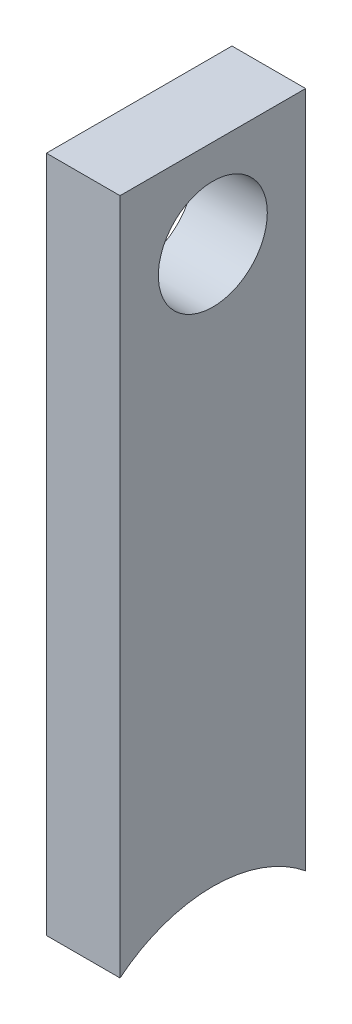
ISO-10303-21;
HEADER;
FILE_DESCRIPTION(('STEP AP214'),'2;1');
FILE_NAME('part.step','',(''),(''),'','','');
FILE_SCHEMA(('AUTOMOTIVE_DESIGN { 1 0 10303 214 1 1 1 1 }'));
ENDSEC;
DATA;
#1=APPLICATION_CONTEXT('core data for automotive mechanical design processes');
#2=APPLICATION_PROTOCOL_DEFINITION('international standard','automotive_design',2000,#1);
#3=PRODUCT_CONTEXT('',#1,'mechanical');
#4=PRODUCT('Part','Part','',(#3));
#5=PRODUCT_RELATED_PRODUCT_CATEGORY('part','',(#4));
#6=PRODUCT_DEFINITION_FORMATION('','',#4);
#7=PRODUCT_DEFINITION_CONTEXT('part definition',#1,'design');
#8=PRODUCT_DEFINITION('design','',#6,#7);
#9=PRODUCT_DEFINITION_SHAPE('','',#8);
#10=(LENGTH_UNIT() NAMED_UNIT(*) SI_UNIT(.MILLI.,.METRE.));
#11=(NAMED_UNIT(*) PLANE_ANGLE_UNIT() SI_UNIT($,.RADIAN.));
#12=(NAMED_UNIT(*) SI_UNIT($,.STERADIAN.) SOLID_ANGLE_UNIT());
#13=UNCERTAINTY_MEASURE_WITH_UNIT(LENGTH_MEASURE(1.E-05),#10,'distance_accuracy_value','');
#14=(GEOMETRIC_REPRESENTATION_CONTEXT(3) GLOBAL_UNCERTAINTY_ASSIGNED_CONTEXT((#13)) GLOBAL_UNIT_ASSIGNED_CONTEXT((#10,
#11,#12)) REPRESENTATION_CONTEXT('',''));
#15=CARTESIAN_POINT('',(0.,0.,0.));
#16=DIRECTION('',(0.,0.,1.));
#17=DIRECTION('',(1.,0.,0.));
#18=AXIS2_PLACEMENT_3D('',#15,#16,#17);
#19=CARTESIAN_POINT('',(25.,-115.,-31.5));
#20=DIRECTION('',(0.,0.,1.));
#21=DIRECTION('',(1.,0.,0.));
#22=AXIS2_PLACEMENT_3D('',#19,#20,#21);
#23=PLANE('',#22);
#24=DIRECTION('',(0.,1.,0.));
#25=VECTOR('',#24,1.);
#26=CARTESIAN_POINT('',(0.,-115.,-31.5));
#27=LINE('',#26,#25);
#28=CARTESIAN_POINT('',(0.,-115.,-31.5));
#29=VERTEX_POINT('',#28);
#30=CARTESIAN_POINT('',(0.,115.,-31.5));
#31=VERTEX_POINT('',#30);
#32=EDGE_CURVE('E96',#29,#31,#27,.T.);
#33=ORIENTED_EDGE('',*,*,#32,.T.);
#34=DIRECTION('',(-1.,0.,0.));
#35=VECTOR('',#34,1.);
#36=CARTESIAN_POINT('',(25.,115.,-31.5));
#37=LINE('',#36,#35);
#38=CARTESIAN_POINT('',(25.,115.,-31.5));
#39=VERTEX_POINT('',#38);
#40=EDGE_CURVE('E11',#39,#31,#37,.T.);
#41=ORIENTED_EDGE('',*,*,#40,.F.);
#42=DIRECTION('',(0.,1.,0.));
#43=VECTOR('',#42,1.);
#44=CARTESIAN_POINT('',(25.,-115.,-31.5));
#45=LINE('',#44,#43);
#46=CARTESIAN_POINT('',(25.,-115.,-31.5));
#47=VERTEX_POINT('',#46);
#48=EDGE_CURVE('E84',#47,#39,#45,.T.);
#49=ORIENTED_EDGE('',*,*,#48,.F.);
#50=DIRECTION('',(-1.,0.,0.));
#51=VECTOR('',#50,1.);
#52=CARTESIAN_POINT('',(25.,-115.,-31.5));
#53=LINE('',#52,#51);
#54=EDGE_CURVE('E92',#47,#29,#53,.T.);
#55=ORIENTED_EDGE('',*,*,#54,.T.);
#56=EDGE_LOOP('',(#33,#41,#49,#55));
#57=FACE_BOUND('',#56,.T.);
#58=ADVANCED_FACE('F33',(#57),#23,.F.);
#59=CARTESIAN_POINT('',(25.,115.,31.5));
#60=DIRECTION('',(0.,-1.,0.));
#61=DIRECTION('',(0.,0.,-1.));
#62=AXIS2_PLACEMENT_3D('',#59,#60,#61);
#63=PLANE('',#62);
#64=DIRECTION('',(0.,0.,1.));
#65=VECTOR('',#64,1.);
#66=CARTESIAN_POINT('',(0.,115.,31.5));
#67=LINE('',#66,#65);
#68=CARTESIAN_POINT('',(0.,115.,31.5));
#69=VERTEX_POINT('',#68);
#70=EDGE_CURVE('E88',#31,#69,#67,.T.);
#71=ORIENTED_EDGE('',*,*,#70,.T.);
#72=DIRECTION('',(-1.,0.,0.));
#73=VECTOR('',#72,1.);
#74=CARTESIAN_POINT('',(25.,115.,31.5));
#75=LINE('',#74,#73);
#76=CARTESIAN_POINT('',(25.,115.,31.5));
#77=VERTEX_POINT('',#76);
#78=EDGE_CURVE('E41',#77,#69,#75,.T.);
#79=ORIENTED_EDGE('',*,*,#78,.F.);
#80=DIRECTION('',(0.,0.,1.));
#81=VECTOR('',#80,1.);
#82=CARTESIAN_POINT('',(25.,115.,31.5));
#83=LINE('',#82,#81);
#84=EDGE_CURVE('E79',#39,#77,#83,.T.);
#85=ORIENTED_EDGE('',*,*,#84,.F.);
#86=ORIENTED_EDGE('',*,*,#40,.T.);
#87=EDGE_LOOP('',(#71,#79,#85,#86));
#88=FACE_BOUND('',#87,.T.);
#89=ADVANCED_FACE('F87',(#88),#63,.F.);
#90=CARTESIAN_POINT('',(25.,-115.,31.5));
#91=DIRECTION('',(0.,0.,-1.));
#92=DIRECTION('',(-1.,0.,0.));
#93=AXIS2_PLACEMENT_3D('',#90,#91,#92);
#94=PLANE('',#93);
#95=DIRECTION('',(0.,-1.,0.));
#96=VECTOR('',#95,1.);
#97=CARTESIAN_POINT('',(0.,-115.,31.5));
#98=LINE('',#97,#96);
#99=CARTESIAN_POINT('',(0.,-115.,31.5));
#100=VERTEX_POINT('',#99);
#101=EDGE_CURVE('E66',#69,#100,#98,.T.);
#102=ORIENTED_EDGE('',*,*,#101,.T.);
#103=DIRECTION('',(-1.,0.,0.));
#104=VECTOR('',#103,1.);
#105=CARTESIAN_POINT('',(25.,-115.,31.5));
#106=LINE('',#105,#104);
#107=CARTESIAN_POINT('',(25.,-115.,31.5));
#108=VERTEX_POINT('',#107);
#109=EDGE_CURVE('E89',#108,#100,#106,.T.);
#110=ORIENTED_EDGE('',*,*,#109,.F.);
#111=DIRECTION('',(0.,-1.,0.));
#112=VECTOR('',#111,1.);
#113=CARTESIAN_POINT('',(25.,-115.,31.5));
#114=LINE('',#113,#112);
#115=EDGE_CURVE('E82',#77,#108,#114,.T.);
#116=ORIENTED_EDGE('',*,*,#115,.F.);
#117=ORIENTED_EDGE('',*,*,#78,.T.);
#118=EDGE_LOOP('',(#102,#110,#116,#117));
#119=FACE_BOUND('',#118,.T.);
#120=ADVANCED_FACE('F90',(#119),#94,.F.);
#121=CARTESIAN_POINT('',(25.,-153.829756630708,0.));
#122=DIRECTION('',(-1.,0.,0.));
#123=DIRECTION('',(0.,0.,1.));
#124=AXIS2_PLACEMENT_3D('',#121,#122,#123);
#125=CYLINDRICAL_SURFACE('',#124,50.);
#126=CARTESIAN_POINT('',(0.,-153.829756630708,0.));
#127=DIRECTION('',(-1.,0.,0.));
#128=DIRECTION('',(0.,0.,-1.));
#129=AXIS2_PLACEMENT_3D('',#126,#127,#128);
#130=CIRCLE('',#129,50.);
#131=EDGE_CURVE('E72',#100,#29,#130,.T.);
#132=ORIENTED_EDGE('',*,*,#131,.T.);
#133=ORIENTED_EDGE('',*,*,#54,.F.);
#134=CARTESIAN_POINT('',(25.,-153.829756630708,0.));
#135=DIRECTION('',(-1.,0.,0.));
#136=DIRECTION('',(0.,0.,-1.));
#137=AXIS2_PLACEMENT_3D('',#134,#135,#136);
#138=CIRCLE('',#137,50.);
#139=EDGE_CURVE('E49',#108,#47,#138,.T.);
#140=ORIENTED_EDGE('',*,*,#139,.F.);
#141=ORIENTED_EDGE('',*,*,#109,.T.);
#142=EDGE_LOOP('',(#132,#133,#140,#141));
#143=FACE_BOUND('',#142,.T.);
#144=ADVANCED_FACE('F104',(#143),#125,.F.);
#145=CARTESIAN_POINT('',(25.,-153.829756630708,0.));
#146=DIRECTION('',(1.,0.,0.));
#147=DIRECTION('',(0.,0.,-1.));
#148=AXIS2_PLACEMENT_3D('',#145,#146,#147);
#149=PLANE('',#148);
#150=CARTESIAN_POINT('',(25.,85.,0.));
#151=DIRECTION('',(1.,0.,0.));
#152=DIRECTION('',(0.,0.,-1.));
#153=AXIS2_PLACEMENT_3D('',#150,#151,#152);
#154=CIRCLE('',#153,18.5);
#155=CARTESIAN_POINT('',(25.,85.,-18.5));
#156=VERTEX_POINT('',#155);
#157=EDGE_CURVE('E99',#156,#156,#154,.T.);
#158=ORIENTED_EDGE('',*,*,#157,.F.);
#159=EDGE_LOOP('',(#158));
#160=FACE_BOUND('',#159,.T.);
#161=ORIENTED_EDGE('',*,*,#48,.T.);
#162=ORIENTED_EDGE('',*,*,#84,.T.);
#163=ORIENTED_EDGE('',*,*,#115,.T.);
#164=ORIENTED_EDGE('',*,*,#139,.T.);
#165=EDGE_LOOP('',(#161,#162,#163,#164));
#166=FACE_BOUND('',#165,.T.);
#167=ADVANCED_FACE('F80',(#160,#166),#149,.T.);
#168=CARTESIAN_POINT('',(0.,-153.829756630708,0.));
#169=DIRECTION('',(1.,0.,0.));
#170=DIRECTION('',(0.,0.,-1.));
#171=AXIS2_PLACEMENT_3D('',#168,#169,#170);
#172=PLANE('',#171);
#173=CARTESIAN_POINT('',(0.,85.,0.));
#174=DIRECTION('',(1.,0.,0.));
#175=DIRECTION('',(0.,0.,-1.));
#176=AXIS2_PLACEMENT_3D('',#173,#174,#175);
#177=CIRCLE('',#176,18.5);
#178=CARTESIAN_POINT('',(0.,85.,-18.5));
#179=VERTEX_POINT('',#178);
#180=EDGE_CURVE('E112',#179,#179,#177,.T.);
#181=ORIENTED_EDGE('',*,*,#180,.T.);
#182=EDGE_LOOP('',(#181));
#183=FACE_BOUND('',#182,.T.);
#184=ORIENTED_EDGE('',*,*,#32,.F.);
#185=ORIENTED_EDGE('',*,*,#131,.F.);
#186=ORIENTED_EDGE('',*,*,#101,.F.);
#187=ORIENTED_EDGE('',*,*,#70,.F.);
#188=EDGE_LOOP('',(#184,#185,#186,#187));
#189=FACE_BOUND('',#188,.T.);
#190=ADVANCED_FACE('F107',(#183,#189),#172,.F.);
#191=CARTESIAN_POINT('',(0.,85.,0.));
#192=DIRECTION('',(1.,0.,0.));
#193=DIRECTION('',(0.,0.,-1.));
#194=AXIS2_PLACEMENT_3D('',#191,#192,#193);
#195=CYLINDRICAL_SURFACE('',#194,18.5);
#196=ORIENTED_EDGE('',*,*,#157,.T.);
#197=EDGE_LOOP('',(#196));
#198=FACE_BOUND('',#197,.T.);
#199=ORIENTED_EDGE('',*,*,#180,.F.);
#200=EDGE_LOOP('',(#199));
#201=FACE_BOUND('',#200,.T.);
#202=ADVANCED_FACE('F117',(#198,#201),#195,.F.);
#203=CLOSED_SHELL('',(#58,#89,#120,#144,#167,#190,#202));
#204=MANIFOLD_SOLID_BREP('B2',#203);
#205=ADVANCED_BREP_SHAPE_REPRESENTATION('',(#18,#204),#14);
#206=SHAPE_DEFINITION_REPRESENTATION(#9,#205);
ENDSEC;
END-ISO-10303-21;
